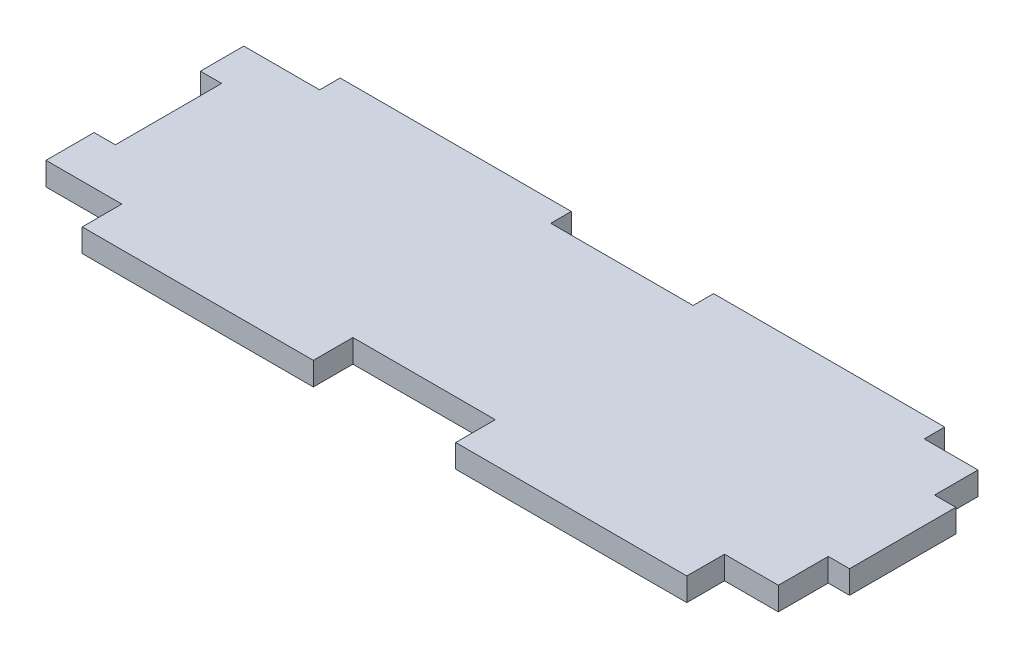
ISO-10303-21;
HEADER;
FILE_DESCRIPTION(('STEP AP214'),'2;1');
FILE_NAME('part.step','',(''),(''),'','','');
FILE_SCHEMA(('AUTOMOTIVE_DESIGN { 1 0 10303 214 1 1 1 1 }'));
ENDSEC;
DATA;
#1=APPLICATION_CONTEXT('core data for automotive mechanical design processes');
#2=APPLICATION_PROTOCOL_DEFINITION('international standard','automotive_design',2000,#1);
#3=PRODUCT_CONTEXT('',#1,'mechanical');
#4=PRODUCT('Part','Part','',(#3));
#5=PRODUCT_RELATED_PRODUCT_CATEGORY('part','',(#4));
#6=PRODUCT_DEFINITION_FORMATION('','',#4);
#7=PRODUCT_DEFINITION_CONTEXT('part definition',#1,'design');
#8=PRODUCT_DEFINITION('design','',#6,#7);
#9=PRODUCT_DEFINITION_SHAPE('','',#8);
#10=(LENGTH_UNIT() NAMED_UNIT(*) SI_UNIT(.MILLI.,.METRE.));
#11=(NAMED_UNIT(*) PLANE_ANGLE_UNIT() SI_UNIT($,.RADIAN.));
#12=(NAMED_UNIT(*) SI_UNIT($,.STERADIAN.) SOLID_ANGLE_UNIT());
#13=UNCERTAINTY_MEASURE_WITH_UNIT(LENGTH_MEASURE(1.E-05),#10,'distance_accuracy_value','');
#14=(GEOMETRIC_REPRESENTATION_CONTEXT(3) GLOBAL_UNCERTAINTY_ASSIGNED_CONTEXT((#13)) GLOBAL_UNIT_ASSIGNED_CONTEXT((#10,
#11,#12)) REPRESENTATION_CONTEXT('',''));
#15=CARTESIAN_POINT('',(0.,0.,0.));
#16=DIRECTION('',(0.,0.,1.));
#17=DIRECTION('',(1.,0.,0.));
#18=AXIS2_PLACEMENT_3D('',#15,#16,#17);
#19=CARTESIAN_POINT('',(-49.022,1.5875,-7.3025));
#20=DIRECTION('',(0.,0.,-1.));
#21=DIRECTION('',(-1.,0.,0.));
#22=AXIS2_PLACEMENT_3D('',#19,#20,#21);
#23=PLANE('',#22);
#24=DIRECTION('',(1.,0.,0.));
#25=VECTOR('',#24,1.);
#26=CARTESIAN_POINT('',(-49.022,-1.5875,-7.3025));
#27=LINE('',#26,#25);
#28=CARTESIAN_POINT('',(-51.943,-1.5875,-7.3025));
#29=VERTEX_POINT('',#28);
#30=CARTESIAN_POINT('',(-49.022,-1.5875,-7.3025));
#31=VERTEX_POINT('',#30);
#32=EDGE_CURVE('E332',#29,#31,#27,.T.);
#33=ORIENTED_EDGE('',*,*,#32,.T.);
#34=DIRECTION('',(0.,-1.,0.));
#35=VECTOR('',#34,1.);
#36=CARTESIAN_POINT('',(-49.022,1.5875,-7.3025));
#37=LINE('',#36,#35);
#38=CARTESIAN_POINT('',(-49.022,1.5875,-7.3025));
#39=VERTEX_POINT('',#38);
#40=EDGE_CURVE('E11',#39,#31,#37,.T.);
#41=ORIENTED_EDGE('',*,*,#40,.F.);
#42=DIRECTION('',(1.,0.,0.));
#43=VECTOR('',#42,1.);
#44=CARTESIAN_POINT('',(-49.022,1.5875,-7.3025));
#45=LINE('',#44,#43);
#46=CARTESIAN_POINT('',(-51.943,1.5875,-7.3025));
#47=VERTEX_POINT('',#46);
#48=EDGE_CURVE('E271',#47,#39,#45,.T.);
#49=ORIENTED_EDGE('',*,*,#48,.F.);
#50=DIRECTION('',(0.,-1.,0.));
#51=VECTOR('',#50,1.);
#52=CARTESIAN_POINT('',(-51.943,1.5875,-7.3025));
#53=LINE('',#52,#51);
#54=EDGE_CURVE('E272',#47,#29,#53,.T.);
#55=ORIENTED_EDGE('',*,*,#54,.T.);
#56=EDGE_LOOP('',(#33,#41,#49,#55));
#57=FACE_BOUND('',#56,.T.);
#58=ADVANCED_FACE('F32',(#57),#23,.F.);
#59=CARTESIAN_POINT('',(-49.022,1.5875,7.3025));
#60=DIRECTION('',(1.,0.,0.));
#61=DIRECTION('',(0.,0.,-1.));
#62=AXIS2_PLACEMENT_3D('',#59,#60,#61);
#63=PLANE('',#62);
#64=DIRECTION('',(0.,0.,1.));
#65=VECTOR('',#64,1.);
#66=CARTESIAN_POINT('',(-49.022,-1.5875,7.3025));
#67=LINE('',#66,#65);
#68=CARTESIAN_POINT('',(-49.022,-1.5875,7.3025));
#69=VERTEX_POINT('',#68);
#70=EDGE_CURVE('E326',#31,#69,#67,.T.);
#71=ORIENTED_EDGE('',*,*,#70,.T.);
#72=DIRECTION('',(0.,-1.,0.));
#73=VECTOR('',#72,1.);
#74=CARTESIAN_POINT('',(-49.022,1.5875,7.3025));
#75=LINE('',#74,#73);
#76=CARTESIAN_POINT('',(-49.022,1.5875,7.3025));
#77=VERTEX_POINT('',#76);
#78=EDGE_CURVE('E39',#77,#69,#75,.T.);
#79=ORIENTED_EDGE('',*,*,#78,.F.);
#80=DIRECTION('',(0.,0.,1.));
#81=VECTOR('',#80,1.);
#82=CARTESIAN_POINT('',(-49.022,1.5875,7.3025));
#83=LINE('',#82,#81);
#84=EDGE_CURVE('E404',#39,#77,#83,.T.);
#85=ORIENTED_EDGE('',*,*,#84,.F.);
#86=ORIENTED_EDGE('',*,*,#40,.T.);
#87=EDGE_LOOP('',(#71,#79,#85,#86));
#88=FACE_BOUND('',#87,.T.);
#89=ADVANCED_FACE('F437',(#88),#63,.F.);
#90=CARTESIAN_POINT('',(-49.022,1.5875,7.3025));
#91=DIRECTION('',(0.,0.,1.));
#92=DIRECTION('',(1.,0.,0.));
#93=AXIS2_PLACEMENT_3D('',#90,#91,#92);
#94=PLANE('',#93);
#95=DIRECTION('',(-1.,0.,0.));
#96=VECTOR('',#95,1.);
#97=CARTESIAN_POINT('',(-49.022,-1.5875,7.3025));
#98=LINE('',#97,#96);
#99=CARTESIAN_POINT('',(-51.943,-1.5875,7.3025));
#100=VERTEX_POINT('',#99);
#101=EDGE_CURVE('E321',#69,#100,#98,.T.);
#102=ORIENTED_EDGE('',*,*,#101,.T.);
#103=DIRECTION('',(0.,-1.,0.));
#104=VECTOR('',#103,1.);
#105=CARTESIAN_POINT('',(-51.943,1.5875,7.3025));
#106=LINE('',#105,#104);
#107=CARTESIAN_POINT('',(-51.943,1.5875,7.3025));
#108=VERTEX_POINT('',#107);
#109=EDGE_CURVE('E312',#108,#100,#106,.T.);
#110=ORIENTED_EDGE('',*,*,#109,.F.);
#111=DIRECTION('',(-1.,0.,0.));
#112=VECTOR('',#111,1.);
#113=CARTESIAN_POINT('',(-49.022,1.5875,7.3025));
#114=LINE('',#113,#112);
#115=EDGE_CURVE('E322',#77,#108,#114,.T.);
#116=ORIENTED_EDGE('',*,*,#115,.F.);
#117=ORIENTED_EDGE('',*,*,#78,.T.);
#118=EDGE_LOOP('',(#102,#110,#116,#117));
#119=FACE_BOUND('',#118,.T.);
#120=ADVANCED_FACE('F319',(#119),#94,.F.);
#121=CARTESIAN_POINT('',(-51.943,1.5875,7.3025));
#122=DIRECTION('',(1.,0.,0.));
#123=DIRECTION('',(0.,0.,-1.));
#124=AXIS2_PLACEMENT_3D('',#121,#122,#123);
#125=PLANE('',#124);
#126=DIRECTION('',(0.,0.,1.));
#127=VECTOR('',#126,1.);
#128=CARTESIAN_POINT('',(-51.943,-1.5875,7.3025));
#129=LINE('',#128,#127);
#130=CARTESIAN_POINT('',(-51.943,-1.5875,13.9065));
#131=VERTEX_POINT('',#130);
#132=EDGE_CURVE('E328',#100,#131,#129,.T.);
#133=ORIENTED_EDGE('',*,*,#132,.T.);
#134=DIRECTION('',(0.,-1.,0.));
#135=VECTOR('',#134,1.);
#136=CARTESIAN_POINT('',(-51.943,1.5875,13.9065));
#137=LINE('',#136,#135);
#138=CARTESIAN_POINT('',(-51.943,1.5875,13.9065));
#139=VERTEX_POINT('',#138);
#140=EDGE_CURVE('E309',#139,#131,#137,.T.);
#141=ORIENTED_EDGE('',*,*,#140,.F.);
#142=DIRECTION('',(0.,0.,1.));
#143=VECTOR('',#142,1.);
#144=CARTESIAN_POINT('',(-51.943,1.5875,7.3025));
#145=LINE('',#144,#143);
#146=EDGE_CURVE('E407',#108,#139,#145,.T.);
#147=ORIENTED_EDGE('',*,*,#146,.F.);
#148=ORIENTED_EDGE('',*,*,#109,.T.);
#149=EDGE_LOOP('',(#133,#141,#147,#148));
#150=FACE_BOUND('',#149,.T.);
#151=ADVANCED_FACE('F435',(#150),#125,.F.);
#152=CARTESIAN_POINT('',(-51.943,1.5875,13.9065));
#153=DIRECTION('',(0.,0.,-1.));
#154=DIRECTION('',(-1.,0.,0.));
#155=AXIS2_PLACEMENT_3D('',#152,#153,#154);
#156=PLANE('',#155);
#157=DIRECTION('',(1.,0.,0.));
#158=VECTOR('',#157,1.);
#159=CARTESIAN_POINT('',(-51.943,-1.5875,13.9065));
#160=LINE('',#159,#158);
#161=CARTESIAN_POINT('',(-41.529,-1.5875,13.9065));
#162=VERTEX_POINT('',#161);
#163=EDGE_CURVE('E330',#131,#162,#160,.T.);
#164=ORIENTED_EDGE('',*,*,#163,.T.);
#165=DIRECTION('',(0.,-1.,0.));
#166=VECTOR('',#165,1.);
#167=CARTESIAN_POINT('',(-41.529,1.5875,13.9065));
#168=LINE('',#167,#166);
#169=CARTESIAN_POINT('',(-41.529,1.5875,13.9065));
#170=VERTEX_POINT('',#169);
#171=EDGE_CURVE('E306',#170,#162,#168,.T.);
#172=ORIENTED_EDGE('',*,*,#171,.F.);
#173=DIRECTION('',(1.,0.,0.));
#174=VECTOR('',#173,1.);
#175=CARTESIAN_POINT('',(-51.943,1.5875,13.9065));
#176=LINE('',#175,#174);
#177=EDGE_CURVE('E409',#139,#170,#176,.T.);
#178=ORIENTED_EDGE('',*,*,#177,.F.);
#179=ORIENTED_EDGE('',*,*,#140,.T.);
#180=EDGE_LOOP('',(#164,#172,#178,#179));
#181=FACE_BOUND('',#180,.T.);
#182=ADVANCED_FACE('F431',(#181),#156,.F.);
#183=CARTESIAN_POINT('',(-41.529,1.5875,13.9065));
#184=DIRECTION('',(1.,0.,0.));
#185=DIRECTION('',(0.,0.,-1.));
#186=AXIS2_PLACEMENT_3D('',#183,#184,#185);
#187=PLANE('',#186);
#188=DIRECTION('',(0.,0.,1.));
#189=VECTOR('',#188,1.);
#190=CARTESIAN_POINT('',(-41.529,-1.5875,13.9065));
#191=LINE('',#190,#189);
#192=CARTESIAN_POINT('',(-41.529,-1.5875,19.3421));
#193=VERTEX_POINT('',#192);
#194=EDGE_CURVE('E337',#162,#193,#191,.T.);
#195=ORIENTED_EDGE('',*,*,#194,.T.);
#196=DIRECTION('',(0.,-1.,0.));
#197=VECTOR('',#196,1.);
#198=CARTESIAN_POINT('',(-41.529,1.5875,19.3421));
#199=LINE('',#198,#197);
#200=CARTESIAN_POINT('',(-41.529,1.5875,19.3421));
#201=VERTEX_POINT('',#200);
#202=EDGE_CURVE('E303',#201,#193,#199,.T.);
#203=ORIENTED_EDGE('',*,*,#202,.F.);
#204=DIRECTION('',(0.,0.,1.));
#205=VECTOR('',#204,1.);
#206=CARTESIAN_POINT('',(-41.529,1.5875,13.9065));
#207=LINE('',#206,#205);
#208=EDGE_CURVE('E411',#170,#201,#207,.T.);
#209=ORIENTED_EDGE('',*,*,#208,.F.);
#210=ORIENTED_EDGE('',*,*,#171,.T.);
#211=EDGE_LOOP('',(#195,#203,#209,#210));
#212=FACE_BOUND('',#211,.T.);
#213=ADVANCED_FACE('F427',(#212),#187,.F.);
#214=CARTESIAN_POINT('',(-41.529,1.5875,19.3421));
#215=DIRECTION('',(0.,0.,-1.));
#216=DIRECTION('',(-1.,0.,0.));
#217=AXIS2_PLACEMENT_3D('',#214,#215,#216);
#218=PLANE('',#217);
#219=DIRECTION('',(1.,0.,0.));
#220=VECTOR('',#219,1.);
#221=CARTESIAN_POINT('',(-41.529,-1.5875,19.3421));
#222=LINE('',#221,#220);
#223=CARTESIAN_POINT('',(-9.77899999999999,-1.5875,19.3421));
#224=VERTEX_POINT('',#223);
#225=EDGE_CURVE('E339',#193,#224,#222,.T.);
#226=ORIENTED_EDGE('',*,*,#225,.T.);
#227=DIRECTION('',(0.,-1.,0.));
#228=VECTOR('',#227,1.);
#229=CARTESIAN_POINT('',(-9.77899999999999,1.5875,19.3421));
#230=LINE('',#229,#228);
#231=CARTESIAN_POINT('',(-9.77899999999999,1.5875,19.3421));
#232=VERTEX_POINT('',#231);
#233=EDGE_CURVE('E300',#232,#224,#230,.T.);
#234=ORIENTED_EDGE('',*,*,#233,.F.);
#235=DIRECTION('',(1.,0.,0.));
#236=VECTOR('',#235,1.);
#237=CARTESIAN_POINT('',(-41.529,1.5875,19.3421));
#238=LINE('',#237,#236);
#239=EDGE_CURVE('E413',#201,#232,#238,.T.);
#240=ORIENTED_EDGE('',*,*,#239,.F.);
#241=ORIENTED_EDGE('',*,*,#202,.T.);
#242=EDGE_LOOP('',(#226,#234,#240,#241));
#243=FACE_BOUND('',#242,.T.);
#244=ADVANCED_FACE('F423',(#243),#218,.F.);
#245=CARTESIAN_POINT('',(-9.77899999999999,1.5875,19.3421));
#246=DIRECTION('',(-1.,0.,0.));
#247=DIRECTION('',(0.,0.,1.));
#248=AXIS2_PLACEMENT_3D('',#245,#246,#247);
#249=PLANE('',#248);
#250=DIRECTION('',(0.,0.,-1.));
#251=VECTOR('',#250,1.);
#252=CARTESIAN_POINT('',(-9.77899999999999,-1.5875,19.3421));
#253=LINE('',#252,#251);
#254=CARTESIAN_POINT('',(-9.779,-1.5875,13.9065));
#255=VERTEX_POINT('',#254);
#256=EDGE_CURVE('E341',#224,#255,#253,.T.);
#257=ORIENTED_EDGE('',*,*,#256,.T.);
#258=DIRECTION('',(0.,-1.,0.));
#259=VECTOR('',#258,1.);
#260=CARTESIAN_POINT('',(-9.779,1.5875,13.9065));
#261=LINE('',#260,#259);
#262=CARTESIAN_POINT('',(-9.779,1.5875,13.9065));
#263=VERTEX_POINT('',#262);
#264=EDGE_CURVE('E297',#263,#255,#261,.T.);
#265=ORIENTED_EDGE('',*,*,#264,.F.);
#266=DIRECTION('',(0.,0.,-1.));
#267=VECTOR('',#266,1.);
#268=CARTESIAN_POINT('',(-9.77899999999999,1.5875,19.3421));
#269=LINE('',#268,#267);
#270=EDGE_CURVE('E359',#232,#263,#269,.T.);
#271=ORIENTED_EDGE('',*,*,#270,.F.);
#272=ORIENTED_EDGE('',*,*,#233,.T.);
#273=EDGE_LOOP('',(#257,#265,#271,#272));
#274=FACE_BOUND('',#273,.T.);
#275=ADVANCED_FACE('F419',(#274),#249,.F.);
#276=CARTESIAN_POINT('',(-9.779,1.5875,13.9065));
#277=DIRECTION('',(0.,0.,-1.));
#278=DIRECTION('',(-1.,0.,0.));
#279=AXIS2_PLACEMENT_3D('',#276,#277,#278);
#280=PLANE('',#279);
#281=DIRECTION('',(1.,0.,0.));
#282=VECTOR('',#281,1.);
#283=CARTESIAN_POINT('',(-9.779,-1.5875,13.9065));
#284=LINE('',#283,#282);
#285=CARTESIAN_POINT('',(9.779,-1.5875,13.9065));
#286=VERTEX_POINT('',#285);
#287=EDGE_CURVE('E245',#255,#286,#284,.T.);
#288=ORIENTED_EDGE('',*,*,#287,.T.);
#289=DIRECTION('',(0.,-1.,0.));
#290=VECTOR('',#289,1.);
#291=CARTESIAN_POINT('',(9.779,1.5875,13.9065));
#292=LINE('',#291,#290);
#293=CARTESIAN_POINT('',(9.779,1.5875,13.9065));
#294=VERTEX_POINT('',#293);
#295=EDGE_CURVE('E294',#294,#286,#292,.T.);
#296=ORIENTED_EDGE('',*,*,#295,.F.);
#297=DIRECTION('',(1.,0.,0.));
#298=VECTOR('',#297,1.);
#299=CARTESIAN_POINT('',(-9.779,1.5875,13.9065));
#300=LINE('',#299,#298);
#301=EDGE_CURVE('E355',#263,#294,#300,.T.);
#302=ORIENTED_EDGE('',*,*,#301,.F.);
#303=ORIENTED_EDGE('',*,*,#264,.T.);
#304=EDGE_LOOP('',(#288,#296,#302,#303));
#305=FACE_BOUND('',#304,.T.);
#306=ADVANCED_FACE('F345',(#305),#280,.F.);
#307=CARTESIAN_POINT('',(9.779,1.5875,13.9065));
#308=DIRECTION('',(1.,0.,0.));
#309=DIRECTION('',(0.,0.,-1.));
#310=AXIS2_PLACEMENT_3D('',#307,#308,#309);
#311=PLANE('',#310);
#312=DIRECTION('',(0.,0.,1.));
#313=VECTOR('',#312,1.);
#314=CARTESIAN_POINT('',(9.779,-1.5875,13.9065));
#315=LINE('',#314,#313);
#316=CARTESIAN_POINT('',(9.779,-1.5875,19.3421));
#317=VERTEX_POINT('',#316);
#318=EDGE_CURVE('E241',#286,#317,#315,.T.);
#319=ORIENTED_EDGE('',*,*,#318,.T.);
#320=DIRECTION('',(0.,-1.,0.));
#321=VECTOR('',#320,1.);
#322=CARTESIAN_POINT('',(9.779,1.5875,19.3421));
#323=LINE('',#322,#321);
#324=CARTESIAN_POINT('',(9.779,1.5875,19.3421));
#325=VERTEX_POINT('',#324);
#326=EDGE_CURVE('E221',#325,#317,#323,.T.);
#327=ORIENTED_EDGE('',*,*,#326,.F.);
#328=DIRECTION('',(0.,0.,1.));
#329=VECTOR('',#328,1.);
#330=CARTESIAN_POINT('',(9.779,1.5875,13.9065));
#331=LINE('',#330,#329);
#332=EDGE_CURVE('E353',#294,#325,#331,.T.);
#333=ORIENTED_EDGE('',*,*,#332,.F.);
#334=ORIENTED_EDGE('',*,*,#295,.T.);
#335=EDGE_LOOP('',(#319,#327,#333,#334));
#336=FACE_BOUND('',#335,.T.);
#337=ADVANCED_FACE('F351',(#336),#311,.F.);
#338=CARTESIAN_POINT('',(41.5279839845032,1.5875,19.5960999050438));
#339=DIRECTION('',(-0.999999982530692,0.,-0.000186918738842688));
#340=DIRECTION('',(-0.000186918738842689,0.,0.999999982530693));
#341=AXIS2_PLACEMENT_3D('',#338,#339,#340);
#342=PLANE('',#341);
#343=DIRECTION('',(0.000186918738842689,0.,-0.999999982530692));
#344=VECTOR('',#343,1.);
#345=CARTESIAN_POINT('',(41.5279839845032,1.5875,19.5960999050438));
#346=LINE('',#345,#344);
#347=CARTESIAN_POINT('',(41.5280314618459,1.5875,19.3421));
#348=VERTEX_POINT('',#347);
#349=CARTESIAN_POINT('',(41.529,1.5875,14.1605));
#350=VERTEX_POINT('',#349);
#351=EDGE_CURVE('E234',#348,#350,#346,.T.);
#352=ORIENTED_EDGE('',*,*,#351,.F.);
#353=DIRECTION('',(0.,1.,0.));
#354=VECTOR('',#353,1.);
#355=CARTESIAN_POINT('',(41.5280314618459,-1.5875,19.3421));
#356=LINE('',#355,#354);
#357=CARTESIAN_POINT('',(41.5280314618459,-1.5875,19.3421));
#358=VERTEX_POINT('',#357);
#359=EDGE_CURVE('E218',#358,#348,#356,.T.);
#360=ORIENTED_EDGE('',*,*,#359,.F.);
#361=DIRECTION('',(0.000186918738842689,0.,-0.999999982530692));
#362=VECTOR('',#361,1.);
#363=CARTESIAN_POINT('',(41.5279839845032,-1.5875,19.5960999050438));
#364=LINE('',#363,#362);
#365=CARTESIAN_POINT('',(41.529,-1.5875,14.1605));
#366=VERTEX_POINT('',#365);
#367=EDGE_CURVE('E232',#358,#366,#364,.T.);
#368=ORIENTED_EDGE('',*,*,#367,.T.);
#369=DIRECTION('',(0.,-1.,0.));
#370=VECTOR('',#369,1.);
#371=CARTESIAN_POINT('',(41.529,1.5875,14.1605));
#372=LINE('',#371,#370);
#373=EDGE_CURVE('E291',#350,#366,#372,.T.);
#374=ORIENTED_EDGE('',*,*,#373,.F.);
#375=EDGE_LOOP('',(#352,#360,#368,#374));
#376=FACE_BOUND('',#375,.T.);
#377=ADVANCED_FACE('F230',(#376),#342,.F.);
#378=CARTESIAN_POINT('',(41.529,1.5875,14.1605));
#379=DIRECTION('',(0.,0.,-1.));
#380=DIRECTION('',(-1.,0.,0.));
#381=AXIS2_PLACEMENT_3D('',#378,#379,#380);
#382=PLANE('',#381);
#383=DIRECTION('',(1.,0.,0.));
#384=VECTOR('',#383,1.);
#385=CARTESIAN_POINT('',(41.529,-1.5875,14.1605));
#386=LINE('',#385,#384);
#387=CARTESIAN_POINT('',(48.9204,-1.5875,14.1605));
#388=VERTEX_POINT('',#387);
#389=EDGE_CURVE('E240',#366,#388,#386,.T.);
#390=ORIENTED_EDGE('',*,*,#389,.T.);
#391=DIRECTION('',(0.,-1.,0.));
#392=VECTOR('',#391,1.);
#393=CARTESIAN_POINT('',(48.9204,1.5875,14.1605));
#394=LINE('',#393,#392);
#395=CARTESIAN_POINT('',(48.9204,1.5875,14.1605));
#396=VERTEX_POINT('',#395);
#397=EDGE_CURVE('E288',#396,#388,#394,.T.);
#398=ORIENTED_EDGE('',*,*,#397,.F.);
#399=DIRECTION('',(1.,0.,0.));
#400=VECTOR('',#399,1.);
#401=CARTESIAN_POINT('',(41.529,1.5875,14.1605));
#402=LINE('',#401,#400);
#403=EDGE_CURVE('E357',#350,#396,#402,.T.);
#404=ORIENTED_EDGE('',*,*,#403,.F.);
#405=ORIENTED_EDGE('',*,*,#373,.T.);
#406=EDGE_LOOP('',(#390,#398,#404,#405));
#407=FACE_BOUND('',#406,.T.);
#408=ADVANCED_FACE('F493',(#407),#382,.F.);
#409=CARTESIAN_POINT('',(48.9204,1.5875,14.1605));
#410=DIRECTION('',(-1.,0.,0.));
#411=DIRECTION('',(0.,0.,1.));
#412=AXIS2_PLACEMENT_3D('',#409,#410,#411);
#413=PLANE('',#412);
#414=DIRECTION('',(0.,0.,-1.));
#415=VECTOR('',#414,1.);
#416=CARTESIAN_POINT('',(48.9204,-1.5875,14.1605));
#417=LINE('',#416,#415);
#418=CARTESIAN_POINT('',(48.9204,-1.5875,7.3025));
#419=VERTEX_POINT('',#418);
#420=EDGE_CURVE('E243',#388,#419,#417,.T.);
#421=ORIENTED_EDGE('',*,*,#420,.T.);
#422=DIRECTION('',(0.,-1.,0.));
#423=VECTOR('',#422,1.);
#424=CARTESIAN_POINT('',(48.9204,1.5875,7.3025));
#425=LINE('',#424,#423);
#426=CARTESIAN_POINT('',(48.9204,1.5875,7.3025));
#427=VERTEX_POINT('',#426);
#428=EDGE_CURVE('E285',#427,#419,#425,.T.);
#429=ORIENTED_EDGE('',*,*,#428,.F.);
#430=DIRECTION('',(0.,0.,-1.));
#431=VECTOR('',#430,1.);
#432=CARTESIAN_POINT('',(48.9204,1.5875,14.1605));
#433=LINE('',#432,#431);
#434=EDGE_CURVE('E364',#396,#427,#433,.T.);
#435=ORIENTED_EDGE('',*,*,#434,.F.);
#436=ORIENTED_EDGE('',*,*,#397,.T.);
#437=EDGE_LOOP('',(#421,#429,#435,#436));
#438=FACE_BOUND('',#437,.T.);
#439=ADVANCED_FACE('F497',(#438),#413,.F.);
#440=CARTESIAN_POINT('',(48.9204,1.5875,7.3025));
#441=DIRECTION('',(0.,0.,-1.));
#442=DIRECTION('',(-1.,0.,0.));
#443=AXIS2_PLACEMENT_3D('',#440,#441,#442);
#444=PLANE('',#443);
#445=DIRECTION('',(1.,0.,0.));
#446=VECTOR('',#445,1.);
#447=CARTESIAN_POINT('',(48.9204,-1.5875,7.3025));
#448=LINE('',#447,#446);
#449=CARTESIAN_POINT('',(51.8414,-1.5875,7.3025));
#450=VERTEX_POINT('',#449);
#451=EDGE_CURVE('E250',#419,#450,#448,.T.);
#452=ORIENTED_EDGE('',*,*,#451,.T.);
#453=DIRECTION('',(0.,-1.,0.));
#454=VECTOR('',#453,1.);
#455=CARTESIAN_POINT('',(51.8414,1.5875,7.3025));
#456=LINE('',#455,#454);
#457=CARTESIAN_POINT('',(51.8414,1.5875,7.3025));
#458=VERTEX_POINT('',#457);
#459=EDGE_CURVE('E282',#458,#450,#456,.T.);
#460=ORIENTED_EDGE('',*,*,#459,.F.);
#461=DIRECTION('',(1.,0.,0.));
#462=VECTOR('',#461,1.);
#463=CARTESIAN_POINT('',(48.9204,1.5875,7.3025));
#464=LINE('',#463,#462);
#465=EDGE_CURVE('E366',#427,#458,#464,.T.);
#466=ORIENTED_EDGE('',*,*,#465,.F.);
#467=ORIENTED_EDGE('',*,*,#428,.T.);
#468=EDGE_LOOP('',(#452,#460,#466,#467));
#469=FACE_BOUND('',#468,.T.);
#470=ADVANCED_FACE('F503',(#469),#444,.F.);
#471=CARTESIAN_POINT('',(51.8414,1.5875,-7.3025));
#472=DIRECTION('',(-1.,0.,0.));
#473=DIRECTION('',(0.,0.,1.));
#474=AXIS2_PLACEMENT_3D('',#471,#472,#473);
#475=PLANE('',#474);
#476=DIRECTION('',(0.,0.,-1.));
#477=VECTOR('',#476,1.);
#478=CARTESIAN_POINT('',(51.8414,-1.5875,-7.3025));
#479=LINE('',#478,#477);
#480=CARTESIAN_POINT('',(51.8414,-1.5875,-7.3025));
#481=VERTEX_POINT('',#480);
#482=EDGE_CURVE('E252',#450,#481,#479,.T.);
#483=ORIENTED_EDGE('',*,*,#482,.T.);
#484=DIRECTION('',(0.,-1.,0.));
#485=VECTOR('',#484,1.);
#486=CARTESIAN_POINT('',(51.8414,1.5875,-7.3025));
#487=LINE('',#486,#485);
#488=CARTESIAN_POINT('',(51.8414,1.5875,-7.3025));
#489=VERTEX_POINT('',#488);
#490=EDGE_CURVE('E279',#489,#481,#487,.T.);
#491=ORIENTED_EDGE('',*,*,#490,.F.);
#492=DIRECTION('',(0.,0.,-1.));
#493=VECTOR('',#492,1.);
#494=CARTESIAN_POINT('',(51.8414,1.5875,-7.3025));
#495=LINE('',#494,#493);
#496=EDGE_CURVE('E368',#458,#489,#495,.T.);
#497=ORIENTED_EDGE('',*,*,#496,.F.);
#498=ORIENTED_EDGE('',*,*,#459,.T.);
#499=EDGE_LOOP('',(#483,#491,#497,#498));
#500=FACE_BOUND('',#499,.T.);
#501=ADVANCED_FACE('F507',(#500),#475,.F.);
#502=CARTESIAN_POINT('',(48.9204,1.5875,-7.3025));
#503=DIRECTION('',(0.,0.,1.));
#504=DIRECTION('',(1.,0.,0.));
#505=AXIS2_PLACEMENT_3D('',#502,#503,#504);
#506=PLANE('',#505);
#507=DIRECTION('',(-1.,0.,0.));
#508=VECTOR('',#507,1.);
#509=CARTESIAN_POINT('',(48.9204,-1.5875,-7.3025));
#510=LINE('',#509,#508);
#511=CARTESIAN_POINT('',(48.9204,-1.5875,-7.3025));
#512=VERTEX_POINT('',#511);
#513=EDGE_CURVE('E254',#481,#512,#510,.T.);
#514=ORIENTED_EDGE('',*,*,#513,.T.);
#515=DIRECTION('',(0.,-1.,0.));
#516=VECTOR('',#515,1.);
#517=CARTESIAN_POINT('',(48.9204,1.5875,-7.3025));
#518=LINE('',#517,#516);
#519=CARTESIAN_POINT('',(48.9204,1.5875,-7.3025));
#520=VERTEX_POINT('',#519);
#521=EDGE_CURVE('E275',#520,#512,#518,.T.);
#522=ORIENTED_EDGE('',*,*,#521,.F.);
#523=DIRECTION('',(-1.,0.,0.));
#524=VECTOR('',#523,1.);
#525=CARTESIAN_POINT('',(48.9204,1.5875,-7.3025));
#526=LINE('',#525,#524);
#527=EDGE_CURVE('E370',#489,#520,#526,.T.);
#528=ORIENTED_EDGE('',*,*,#527,.F.);
#529=ORIENTED_EDGE('',*,*,#490,.T.);
#530=EDGE_LOOP('',(#514,#522,#528,#529));
#531=FACE_BOUND('',#530,.T.);
#532=ADVANCED_FACE('F512',(#531),#506,.F.);
#533=CARTESIAN_POINT('',(48.9204,1.5875,-14.1605));
#534=DIRECTION('',(-1.,0.,0.));
#535=DIRECTION('',(0.,0.,1.));
#536=AXIS2_PLACEMENT_3D('',#533,#534,#535);
#537=PLANE('',#536);
#538=DIRECTION('',(0.,0.,-1.));
#539=VECTOR('',#538,1.);
#540=CARTESIAN_POINT('',(48.9204,-1.5875,-14.1605));
#541=LINE('',#540,#539);
#542=CARTESIAN_POINT('',(48.9204,-1.5875,-13.2715));
#543=VERTEX_POINT('',#542);
#544=EDGE_CURVE('E256',#512,#543,#541,.T.);
#545=ORIENTED_EDGE('',*,*,#544,.T.);
#546=DIRECTION('',(0.,1.,0.));
#547=VECTOR('',#546,1.);
#548=CARTESIAN_POINT('',(48.9204,-1.5875,-13.2715));
#549=LINE('',#548,#547);
#550=CARTESIAN_POINT('',(48.9204,1.5875,-13.2715));
#551=VERTEX_POINT('',#550);
#552=EDGE_CURVE('E464',#543,#551,#549,.T.);
#553=ORIENTED_EDGE('',*,*,#552,.T.);
#554=DIRECTION('',(0.,0.,-1.));
#555=VECTOR('',#554,1.);
#556=CARTESIAN_POINT('',(48.9204,1.5875,-14.1605));
#557=LINE('',#556,#555);
#558=EDGE_CURVE('E372',#520,#551,#557,.T.);
#559=ORIENTED_EDGE('',*,*,#558,.F.);
#560=ORIENTED_EDGE('',*,*,#521,.T.);
#561=EDGE_LOOP('',(#545,#553,#559,#560));
#562=FACE_BOUND('',#561,.T.);
#563=ADVANCED_FACE('F516',(#562),#537,.F.);
#564=CARTESIAN_POINT('',(41.529,1.5875,-16.7259));
#565=DIRECTION('',(-1.,0.,0.));
#566=DIRECTION('',(0.,0.,1.));
#567=AXIS2_PLACEMENT_3D('',#564,#565,#566);
#568=PLANE('',#567);
#569=DIRECTION('',(0.,0.,-1.));
#570=VECTOR('',#569,1.);
#571=CARTESIAN_POINT('',(41.529,-1.5875,-16.7259));
#572=LINE('',#571,#570);
#573=CARTESIAN_POINT('',(41.529,-1.5875,-13.2715));
#574=VERTEX_POINT('',#573);
#575=CARTESIAN_POINT('',(41.529,-1.5875,-16.0909));
#576=VERTEX_POINT('',#575);
#577=EDGE_CURVE('E259',#574,#576,#572,.T.);
#578=ORIENTED_EDGE('',*,*,#577,.T.);
#579=DIRECTION('',(0.,1.,0.));
#580=VECTOR('',#579,1.);
#581=CARTESIAN_POINT('',(41.529,-1.5875,-16.0909));
#582=LINE('',#581,#580);
#583=CARTESIAN_POINT('',(41.529,1.5875,-16.0909));
#584=VERTEX_POINT('',#583);
#585=EDGE_CURVE('E46',#576,#584,#582,.T.);
#586=ORIENTED_EDGE('',*,*,#585,.T.);
#587=DIRECTION('',(0.,0.,-1.));
#588=VECTOR('',#587,1.);
#589=CARTESIAN_POINT('',(41.529,1.5875,-16.7259));
#590=LINE('',#589,#588);
#591=CARTESIAN_POINT('',(41.529,1.5875,-13.2715));
#592=VERTEX_POINT('',#591);
#593=EDGE_CURVE('E375',#592,#584,#590,.T.);
#594=ORIENTED_EDGE('',*,*,#593,.F.);
#595=DIRECTION('',(0.,1.,0.));
#596=VECTOR('',#595,1.);
#597=CARTESIAN_POINT('',(41.529,-1.5875,-13.2715));
#598=LINE('',#597,#596);
#599=EDGE_CURVE('E467',#574,#592,#598,.T.);
#600=ORIENTED_EDGE('',*,*,#599,.F.);
#601=EDGE_LOOP('',(#578,#586,#594,#600));
#602=FACE_BOUND('',#601,.T.);
#603=ADVANCED_FACE('F524',(#602),#568,.F.);
#604=CARTESIAN_POINT('',(9.779,1.5875,-13.9065));
#605=DIRECTION('',(1.,0.,0.));
#606=DIRECTION('',(0.,0.,-1.));
#607=AXIS2_PLACEMENT_3D('',#604,#605,#606);
#608=PLANE('',#607);
#609=DIRECTION('',(0.,0.,1.));
#610=VECTOR('',#609,1.);
#611=CARTESIAN_POINT('',(9.779,1.5875,-13.9065));
#612=LINE('',#611,#610);
#613=CARTESIAN_POINT('',(9.779,1.5875,-16.0909));
#614=VERTEX_POINT('',#613);
#615=CARTESIAN_POINT('',(9.779,1.5875,-13.2715));
#616=VERTEX_POINT('',#615);
#617=EDGE_CURVE('E378',#614,#616,#612,.T.);
#618=ORIENTED_EDGE('',*,*,#617,.F.);
#619=DIRECTION('',(0.,1.,0.));
#620=VECTOR('',#619,1.);
#621=CARTESIAN_POINT('',(9.779,-1.5875,-16.0909));
#622=LINE('',#621,#620);
#623=CARTESIAN_POINT('',(9.779,-1.5875,-16.0909));
#624=VERTEX_POINT('',#623);
#625=EDGE_CURVE('E484',#624,#614,#622,.T.);
#626=ORIENTED_EDGE('',*,*,#625,.F.);
#627=DIRECTION('',(0.,0.,1.));
#628=VECTOR('',#627,1.);
#629=CARTESIAN_POINT('',(9.779,-1.5875,-13.9065));
#630=LINE('',#629,#628);
#631=CARTESIAN_POINT('',(9.779,-1.5875,-13.2715));
#632=VERTEX_POINT('',#631);
#633=EDGE_CURVE('E262',#624,#632,#630,.T.);
#634=ORIENTED_EDGE('',*,*,#633,.T.);
#635=DIRECTION('',(0.,1.,0.));
#636=VECTOR('',#635,1.);
#637=CARTESIAN_POINT('',(9.779,-1.5875,-13.2715));
#638=LINE('',#637,#636);
#639=EDGE_CURVE('E450',#632,#616,#638,.T.);
#640=ORIENTED_EDGE('',*,*,#639,.T.);
#641=EDGE_LOOP('',(#618,#626,#634,#640));
#642=FACE_BOUND('',#641,.T.);
#643=ADVANCED_FACE('F528',(#642),#608,.F.);
#644=CARTESIAN_POINT('',(-9.779,1.5875,-16.7259));
#645=DIRECTION('',(-1.,0.,0.));
#646=DIRECTION('',(0.,0.,1.));
#647=AXIS2_PLACEMENT_3D('',#644,#645,#646);
#648=PLANE('',#647);
#649=DIRECTION('',(0.,0.,-1.));
#650=VECTOR('',#649,1.);
#651=CARTESIAN_POINT('',(-9.779,-1.5875,-16.7259));
#652=LINE('',#651,#650);
#653=CARTESIAN_POINT('',(-9.779,-1.5875,-13.2715));
#654=VERTEX_POINT('',#653);
#655=CARTESIAN_POINT('',(-9.779,-1.5875,-16.0909));
#656=VERTEX_POINT('',#655);
#657=EDGE_CURVE('E264',#654,#656,#652,.T.);
#658=ORIENTED_EDGE('',*,*,#657,.T.);
#659=DIRECTION('',(0.,1.,0.));
#660=VECTOR('',#659,1.);
#661=CARTESIAN_POINT('',(-9.779,-1.5875,-16.0909));
#662=LINE('',#661,#660);
#663=CARTESIAN_POINT('',(-9.779,1.5875,-16.0909));
#664=VERTEX_POINT('',#663);
#665=EDGE_CURVE('E54',#656,#664,#662,.T.);
#666=ORIENTED_EDGE('',*,*,#665,.T.);
#667=DIRECTION('',(0.,0.,-1.));
#668=VECTOR('',#667,1.);
#669=CARTESIAN_POINT('',(-9.779,1.5875,-16.7259));
#670=LINE('',#669,#668);
#671=CARTESIAN_POINT('',(-9.779,1.5875,-13.2715));
#672=VERTEX_POINT('',#671);
#673=EDGE_CURVE('E380',#672,#664,#670,.T.);
#674=ORIENTED_EDGE('',*,*,#673,.F.);
#675=DIRECTION('',(0.,1.,0.));
#676=VECTOR('',#675,1.);
#677=CARTESIAN_POINT('',(-9.779,-1.5875,-13.2715));
#678=LINE('',#677,#676);
#679=EDGE_CURVE('E452',#654,#672,#678,.T.);
#680=ORIENTED_EDGE('',*,*,#679,.F.);
#681=EDGE_LOOP('',(#658,#666,#674,#680));
#682=FACE_BOUND('',#681,.T.);
#683=ADVANCED_FACE('F534',(#682),#648,.F.);
#684=CARTESIAN_POINT('',(-41.529,1.5875,-13.9065));
#685=DIRECTION('',(1.,0.,0.));
#686=DIRECTION('',(0.,0.,-1.));
#687=AXIS2_PLACEMENT_3D('',#684,#685,#686);
#688=PLANE('',#687);
#689=DIRECTION('',(0.,0.,1.));
#690=VECTOR('',#689,1.);
#691=CARTESIAN_POINT('',(-41.529,1.5875,-13.9065));
#692=LINE('',#691,#690);
#693=CARTESIAN_POINT('',(-41.529,1.5875,-16.0909));
#694=VERTEX_POINT('',#693);
#695=CARTESIAN_POINT('',(-41.529,1.5875,-13.2715));
#696=VERTEX_POINT('',#695);
#697=EDGE_CURVE('E383',#694,#696,#692,.T.);
#698=ORIENTED_EDGE('',*,*,#697,.F.);
#699=DIRECTION('',(0.,1.,0.));
#700=VECTOR('',#699,1.);
#701=CARTESIAN_POINT('',(-41.529,-1.5875,-16.0909));
#702=LINE('',#701,#700);
#703=CARTESIAN_POINT('',(-41.529,-1.5875,-16.0909));
#704=VERTEX_POINT('',#703);
#705=EDGE_CURVE('E477',#704,#694,#702,.T.);
#706=ORIENTED_EDGE('',*,*,#705,.F.);
#707=DIRECTION('',(0.,0.,1.));
#708=VECTOR('',#707,1.);
#709=CARTESIAN_POINT('',(-41.529,-1.5875,-13.9065));
#710=LINE('',#709,#708);
#711=CARTESIAN_POINT('',(-41.529,-1.5875,-13.2715));
#712=VERTEX_POINT('',#711);
#713=EDGE_CURVE('E267',#704,#712,#710,.T.);
#714=ORIENTED_EDGE('',*,*,#713,.T.);
#715=DIRECTION('',(0.,1.,0.));
#716=VECTOR('',#715,1.);
#717=CARTESIAN_POINT('',(-41.529,-1.5875,-13.2715));
#718=LINE('',#717,#716);
#719=EDGE_CURVE('E386',#712,#696,#718,.T.);
#720=ORIENTED_EDGE('',*,*,#719,.T.);
#721=EDGE_LOOP('',(#698,#706,#714,#720));
#722=FACE_BOUND('',#721,.T.);
#723=ADVANCED_FACE('F536',(#722),#688,.F.);
#724=CARTESIAN_POINT('',(-51.943,1.5875,-7.3025));
#725=DIRECTION('',(1.,0.,0.));
#726=DIRECTION('',(0.,0.,-1.));
#727=AXIS2_PLACEMENT_3D('',#724,#725,#726);
#728=PLANE('',#727);
#729=DIRECTION('',(0.,0.,1.));
#730=VECTOR('',#729,1.);
#731=CARTESIAN_POINT('',(-51.943,1.5875,-7.3025));
#732=LINE('',#731,#730);
#733=CARTESIAN_POINT('',(-51.943,1.5875,-13.2715));
#734=VERTEX_POINT('',#733);
#735=EDGE_CURVE('E276',#734,#47,#732,.T.);
#736=ORIENTED_EDGE('',*,*,#735,.F.);
#737=DIRECTION('',(0.,1.,0.));
#738=VECTOR('',#737,1.);
#739=CARTESIAN_POINT('',(-51.943,-1.5875,-13.2715));
#740=LINE('',#739,#738);
#741=CARTESIAN_POINT('',(-51.943,-1.5875,-13.2715));
#742=VERTEX_POINT('',#741);
#743=EDGE_CURVE('E390',#742,#734,#740,.T.);
#744=ORIENTED_EDGE('',*,*,#743,.F.);
#745=DIRECTION('',(0.,0.,1.));
#746=VECTOR('',#745,1.);
#747=CARTESIAN_POINT('',(-51.943,-1.5875,-7.3025));
#748=LINE('',#747,#746);
#749=EDGE_CURVE('E269',#742,#29,#748,.T.);
#750=ORIENTED_EDGE('',*,*,#749,.T.);
#751=ORIENTED_EDGE('',*,*,#54,.F.);
#752=EDGE_LOOP('',(#736,#744,#750,#751));
#753=FACE_BOUND('',#752,.T.);
#754=ADVANCED_FACE('F445',(#753),#728,.F.);
#755=CARTESIAN_POINT('',(0.,1.5875,0.));
#756=DIRECTION('',(0.,-1.,0.));
#757=DIRECTION('',(0.,0.,-1.));
#758=AXIS2_PLACEMENT_3D('',#755,#756,#757);
#759=PLANE('',#758);
#760=ORIENTED_EDGE('',*,*,#332,.T.);
#761=DIRECTION('',(-1.,0.,0.));
#762=VECTOR('',#761,1.);
#763=CARTESIAN_POINT('',(9.779,1.5875,19.3421));
#764=LINE('',#763,#762);
#765=EDGE_CURVE('E226',#348,#325,#764,.T.);
#766=ORIENTED_EDGE('',*,*,#765,.F.);
#767=ORIENTED_EDGE('',*,*,#351,.T.);
#768=ORIENTED_EDGE('',*,*,#403,.T.);
#769=ORIENTED_EDGE('',*,*,#434,.T.);
#770=ORIENTED_EDGE('',*,*,#465,.T.);
#771=ORIENTED_EDGE('',*,*,#496,.T.);
#772=ORIENTED_EDGE('',*,*,#527,.T.);
#773=ORIENTED_EDGE('',*,*,#558,.T.);
#774=DIRECTION('',(1.,0.,0.));
#775=VECTOR('',#774,1.);
#776=CARTESIAN_POINT('',(41.529,1.5875,-13.2715));
#777=LINE('',#776,#775);
#778=EDGE_CURVE('E473',#592,#551,#777,.T.);
#779=ORIENTED_EDGE('',*,*,#778,.F.);
#780=ORIENTED_EDGE('',*,*,#593,.T.);
#781=DIRECTION('',(1.,0.,0.));
#782=VECTOR('',#781,1.);
#783=CARTESIAN_POINT('',(9.779,1.5875,-16.0909));
#784=LINE('',#783,#782);
#785=EDGE_CURVE('E235',#614,#584,#784,.T.);
#786=ORIENTED_EDGE('',*,*,#785,.F.);
#787=ORIENTED_EDGE('',*,*,#617,.T.);
#788=DIRECTION('',(1.,0.,0.));
#789=VECTOR('',#788,1.);
#790=CARTESIAN_POINT('',(9.779,1.5875,-13.2715));
#791=LINE('',#790,#789);
#792=EDGE_CURVE('E462',#672,#616,#791,.T.);
#793=ORIENTED_EDGE('',*,*,#792,.F.);
#794=ORIENTED_EDGE('',*,*,#673,.T.);
#795=DIRECTION('',(1.,0.,0.));
#796=VECTOR('',#795,1.);
#797=CARTESIAN_POINT('',(-9.779,1.5875,-16.0909));
#798=LINE('',#797,#796);
#799=EDGE_CURVE('E481',#694,#664,#798,.T.);
#800=ORIENTED_EDGE('',*,*,#799,.F.);
#801=ORIENTED_EDGE('',*,*,#697,.T.);
#802=DIRECTION('',(1.,0.,0.));
#803=VECTOR('',#802,1.);
#804=CARTESIAN_POINT('',(-41.529,1.5875,-13.2715));
#805=LINE('',#804,#803);
#806=EDGE_CURVE('E399',#734,#696,#805,.T.);
#807=ORIENTED_EDGE('',*,*,#806,.F.);
#808=ORIENTED_EDGE('',*,*,#735,.T.);
#809=ORIENTED_EDGE('',*,*,#48,.T.);
#810=ORIENTED_EDGE('',*,*,#84,.T.);
#811=ORIENTED_EDGE('',*,*,#115,.T.);
#812=ORIENTED_EDGE('',*,*,#146,.T.);
#813=ORIENTED_EDGE('',*,*,#177,.T.);
#814=ORIENTED_EDGE('',*,*,#208,.T.);
#815=ORIENTED_EDGE('',*,*,#239,.T.);
#816=ORIENTED_EDGE('',*,*,#270,.T.);
#817=ORIENTED_EDGE('',*,*,#301,.T.);
#818=EDGE_LOOP('',(#760,#766,#767,#768,#769,#770,#771,#772,#773,#779,#780,#786,#787,#793,#794,
#800,#801,#807,#808,#809,#810,#811,#812,#813,#814,#815,#816,#817));
#819=FACE_BOUND('',#818,.T.);
#820=ADVANCED_FACE('F415',(#819),#759,.F.);
#821=CARTESIAN_POINT('',(0.,-1.5875,0.));
#822=DIRECTION('',(0.,-1.,0.));
#823=DIRECTION('',(0.,0.,-1.));
#824=AXIS2_PLACEMENT_3D('',#821,#822,#823);
#825=PLANE('',#824);
#826=DIRECTION('',(-1.,0.,0.));
#827=VECTOR('',#826,1.);
#828=CARTESIAN_POINT('',(9.779,-1.5875,19.3421));
#829=LINE('',#828,#827);
#830=EDGE_CURVE('E215',#358,#317,#829,.T.);
#831=ORIENTED_EDGE('',*,*,#830,.T.);
#832=ORIENTED_EDGE('',*,*,#318,.F.);
#833=ORIENTED_EDGE('',*,*,#287,.F.);
#834=ORIENTED_EDGE('',*,*,#256,.F.);
#835=ORIENTED_EDGE('',*,*,#225,.F.);
#836=ORIENTED_EDGE('',*,*,#194,.F.);
#837=ORIENTED_EDGE('',*,*,#163,.F.);
#838=ORIENTED_EDGE('',*,*,#132,.F.);
#839=ORIENTED_EDGE('',*,*,#101,.F.);
#840=ORIENTED_EDGE('',*,*,#70,.F.);
#841=ORIENTED_EDGE('',*,*,#32,.F.);
#842=ORIENTED_EDGE('',*,*,#749,.F.);
#843=DIRECTION('',(1.,0.,0.));
#844=VECTOR('',#843,1.);
#845=CARTESIAN_POINT('',(-41.529,-1.5875,-13.2715));
#846=LINE('',#845,#844);
#847=EDGE_CURVE('E396',#742,#712,#846,.T.);
#848=ORIENTED_EDGE('',*,*,#847,.T.);
#849=ORIENTED_EDGE('',*,*,#713,.F.);
#850=DIRECTION('',(1.,0.,0.));
#851=VECTOR('',#850,1.);
#852=CARTESIAN_POINT('',(-9.779,-1.5875,-16.0909));
#853=LINE('',#852,#851);
#854=EDGE_CURVE('E479',#704,#656,#853,.T.);
#855=ORIENTED_EDGE('',*,*,#854,.T.);
#856=ORIENTED_EDGE('',*,*,#657,.F.);
#857=DIRECTION('',(1.,0.,0.));
#858=VECTOR('',#857,1.);
#859=CARTESIAN_POINT('',(9.779,-1.5875,-13.2715));
#860=LINE('',#859,#858);
#861=EDGE_CURVE('E459',#654,#632,#860,.T.);
#862=ORIENTED_EDGE('',*,*,#861,.T.);
#863=ORIENTED_EDGE('',*,*,#633,.F.);
#864=DIRECTION('',(1.,0.,0.));
#865=VECTOR('',#864,1.);
#866=CARTESIAN_POINT('',(9.779,-1.5875,-16.0909));
#867=LINE('',#866,#865);
#868=EDGE_CURVE('E486',#624,#576,#867,.T.);
#869=ORIENTED_EDGE('',*,*,#868,.T.);
#870=ORIENTED_EDGE('',*,*,#577,.F.);
#871=DIRECTION('',(1.,0.,0.));
#872=VECTOR('',#871,1.);
#873=CARTESIAN_POINT('',(41.529,-1.5875,-13.2715));
#874=LINE('',#873,#872);
#875=EDGE_CURVE('E470',#574,#543,#874,.T.);
#876=ORIENTED_EDGE('',*,*,#875,.T.);
#877=ORIENTED_EDGE('',*,*,#544,.F.);
#878=ORIENTED_EDGE('',*,*,#513,.F.);
#879=ORIENTED_EDGE('',*,*,#482,.F.);
#880=ORIENTED_EDGE('',*,*,#451,.F.);
#881=ORIENTED_EDGE('',*,*,#420,.F.);
#882=ORIENTED_EDGE('',*,*,#389,.F.);
#883=ORIENTED_EDGE('',*,*,#367,.F.);
#884=EDGE_LOOP('',(#831,#832,#833,#834,#835,#836,#837,#838,#839,#840,#841,#842,#848,#849,#855,
#856,#862,#863,#869,#870,#876,#877,#878,#879,#880,#881,#882,#883));
#885=FACE_BOUND('',#884,.T.);
#886=ADVANCED_FACE('F238',(#885),#825,.T.);
#887=CARTESIAN_POINT('',(-41.529,-1.5875,-13.2715));
#888=DIRECTION('',(0.,0.,1.));
#889=DIRECTION('',(1.,0.,0.));
#890=AXIS2_PLACEMENT_3D('',#887,#888,#889);
#891=PLANE('',#890);
#892=ORIENTED_EDGE('',*,*,#806,.T.);
#893=ORIENTED_EDGE('',*,*,#719,.F.);
#894=ORIENTED_EDGE('',*,*,#847,.F.);
#895=ORIENTED_EDGE('',*,*,#743,.T.);
#896=EDGE_LOOP('',(#892,#893,#894,#895));
#897=FACE_BOUND('',#896,.T.);
#898=ADVANCED_FACE('F448',(#897),#891,.F.);
#899=CARTESIAN_POINT('',(9.779,-1.5875,-13.2715));
#900=DIRECTION('',(0.,0.,1.));
#901=DIRECTION('',(1.,0.,0.));
#902=AXIS2_PLACEMENT_3D('',#899,#900,#901);
#903=PLANE('',#902);
#904=ORIENTED_EDGE('',*,*,#792,.T.);
#905=ORIENTED_EDGE('',*,*,#639,.F.);
#906=ORIENTED_EDGE('',*,*,#861,.F.);
#907=ORIENTED_EDGE('',*,*,#679,.T.);
#908=EDGE_LOOP('',(#904,#905,#906,#907));
#909=FACE_BOUND('',#908,.T.);
#910=ADVANCED_FACE('F532',(#909),#903,.F.);
#911=CARTESIAN_POINT('',(41.529,-1.5875,-13.2715));
#912=DIRECTION('',(0.,0.,1.));
#913=DIRECTION('',(1.,0.,0.));
#914=AXIS2_PLACEMENT_3D('',#911,#912,#913);
#915=PLANE('',#914);
#916=ORIENTED_EDGE('',*,*,#778,.T.);
#917=ORIENTED_EDGE('',*,*,#552,.F.);
#918=ORIENTED_EDGE('',*,*,#875,.F.);
#919=ORIENTED_EDGE('',*,*,#599,.T.);
#920=EDGE_LOOP('',(#916,#917,#918,#919));
#921=FACE_BOUND('',#920,.T.);
#922=ADVANCED_FACE('F520',(#921),#915,.F.);
#923=CARTESIAN_POINT('',(-9.779,-1.5875,-16.0909));
#924=DIRECTION('',(0.,0.,1.));
#925=DIRECTION('',(1.,0.,0.));
#926=AXIS2_PLACEMENT_3D('',#923,#924,#925);
#927=PLANE('',#926);
#928=ORIENTED_EDGE('',*,*,#799,.T.);
#929=ORIENTED_EDGE('',*,*,#665,.F.);
#930=ORIENTED_EDGE('',*,*,#854,.F.);
#931=ORIENTED_EDGE('',*,*,#705,.T.);
#932=EDGE_LOOP('',(#928,#929,#930,#931));
#933=FACE_BOUND('',#932,.T.);
#934=ADVANCED_FACE('F537',(#933),#927,.F.);
#935=CARTESIAN_POINT('',(9.779,-1.5875,-16.0909));
#936=DIRECTION('',(0.,0.,1.));
#937=DIRECTION('',(1.,0.,0.));
#938=AXIS2_PLACEMENT_3D('',#935,#936,#937);
#939=PLANE('',#938);
#940=ORIENTED_EDGE('',*,*,#785,.T.);
#941=ORIENTED_EDGE('',*,*,#585,.F.);
#942=ORIENTED_EDGE('',*,*,#868,.F.);
#943=ORIENTED_EDGE('',*,*,#625,.T.);
#944=EDGE_LOOP('',(#940,#941,#942,#943));
#945=FACE_BOUND('',#944,.T.);
#946=ADVANCED_FACE('F539',(#945),#939,.F.);
#947=CARTESIAN_POINT('',(9.779,-1.5875,19.3421));
#948=DIRECTION('',(0.,0.,-1.));
#949=DIRECTION('',(-1.,0.,0.));
#950=AXIS2_PLACEMENT_3D('',#947,#948,#949);
#951=PLANE('',#950);
#952=ORIENTED_EDGE('',*,*,#765,.T.);
#953=ORIENTED_EDGE('',*,*,#326,.T.);
#954=ORIENTED_EDGE('',*,*,#830,.F.);
#955=ORIENTED_EDGE('',*,*,#359,.T.);
#956=EDGE_LOOP('',(#952,#953,#954,#955));
#957=FACE_BOUND('',#956,.T.);
#958=ADVANCED_FACE('F217',(#957),#951,.F.);
#959=CLOSED_SHELL('',(#58,#89,#120,#151,#182,#213,#244,#275,#306,#337,#377,#408,#439,#470,#501,
#532,#563,#603,#643,#683,#723,#754,#820,#886,#898,#910,#922,#934,#946,#958));
#960=MANIFOLD_SOLID_BREP('B2',#959);
#961=ADVANCED_BREP_SHAPE_REPRESENTATION('',(#18,#960),#14);
#962=SHAPE_DEFINITION_REPRESENTATION(#9,#961);
ENDSEC;
END-ISO-10303-21;
